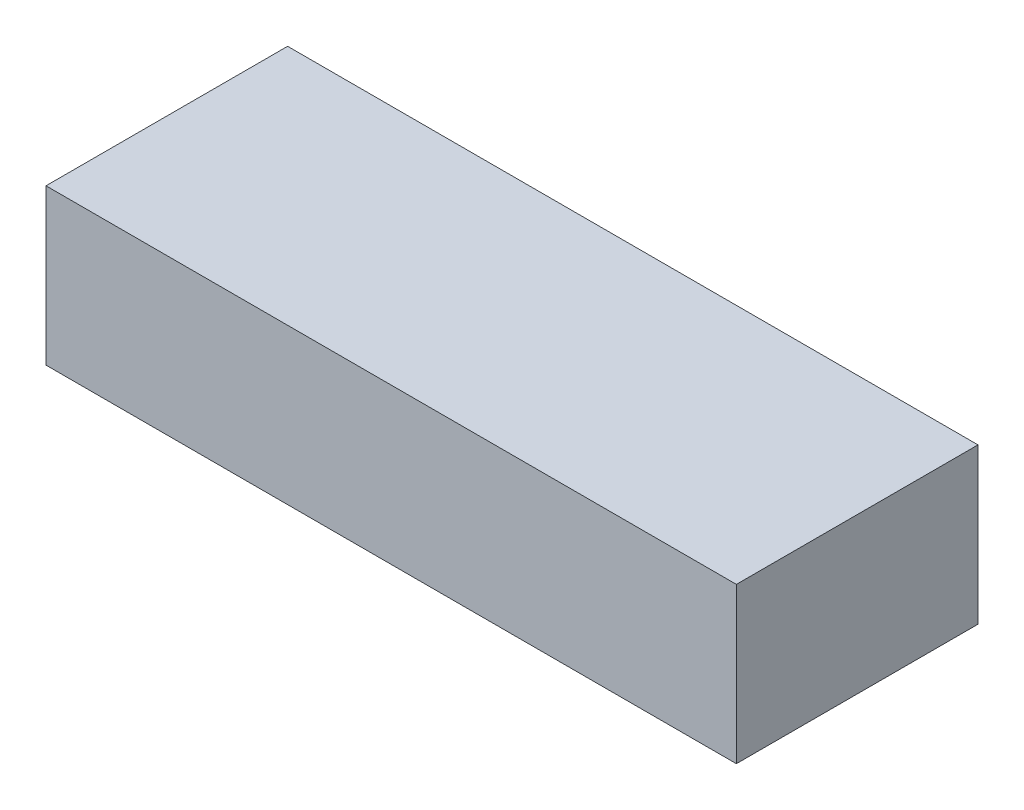
ISO-10303-21;
HEADER;
FILE_DESCRIPTION(('STEP AP214'),'2;1');
FILE_NAME('part.step','',(''),(''),'','','');
FILE_SCHEMA(('AUTOMOTIVE_DESIGN { 1 0 10303 214 1 1 1 1 }'));
ENDSEC;
DATA;
#1=APPLICATION_CONTEXT('core data for automotive mechanical design processes');
#2=APPLICATION_PROTOCOL_DEFINITION('international standard','automotive_design',2000,#1);
#3=PRODUCT_CONTEXT('',#1,'mechanical');
#4=PRODUCT('Part','Part','',(#3));
#5=PRODUCT_RELATED_PRODUCT_CATEGORY('part','',(#4));
#6=PRODUCT_DEFINITION_FORMATION('','',#4);
#7=PRODUCT_DEFINITION_CONTEXT('part definition',#1,'design');
#8=PRODUCT_DEFINITION('design','',#6,#7);
#9=PRODUCT_DEFINITION_SHAPE('','',#8);
#10=(LENGTH_UNIT() NAMED_UNIT(*) SI_UNIT(.MILLI.,.METRE.));
#11=(NAMED_UNIT(*) PLANE_ANGLE_UNIT() SI_UNIT($,.RADIAN.));
#12=(NAMED_UNIT(*) SI_UNIT($,.STERADIAN.) SOLID_ANGLE_UNIT());
#13=UNCERTAINTY_MEASURE_WITH_UNIT(LENGTH_MEASURE(1.E-05),#10,'distance_accuracy_value','');
#14=(GEOMETRIC_REPRESENTATION_CONTEXT(3) GLOBAL_UNCERTAINTY_ASSIGNED_CONTEXT((#13)) GLOBAL_UNIT_ASSIGNED_CONTEXT((#10,
#11,#12)) REPRESENTATION_CONTEXT('',''));
#15=CARTESIAN_POINT('',(0.,0.,0.));
#16=DIRECTION('',(0.,0.,1.));
#17=DIRECTION('',(1.,0.,0.));
#18=AXIS2_PLACEMENT_3D('',#15,#16,#17);
#19=CARTESIAN_POINT('',(20.,9.,-7.));
#20=DIRECTION('',(-1.,0.,0.));
#21=DIRECTION('',(0.,0.,1.));
#22=AXIS2_PLACEMENT_3D('',#19,#20,#21);
#23=PLANE('',#22);
#24=DIRECTION('',(0.,0.,-1.));
#25=VECTOR('',#24,1.);
#26=CARTESIAN_POINT('',(20.,0.,-7.));
#27=LINE('',#26,#25);
#28=CARTESIAN_POINT('',(20.,0.,7.));
#29=VERTEX_POINT('',#28);
#30=CARTESIAN_POINT('',(20.,0.,-7.));
#31=VERTEX_POINT('',#30);
#32=EDGE_CURVE('E96',#29,#31,#27,.T.);
#33=ORIENTED_EDGE('',*,*,#32,.T.);
#34=DIRECTION('',(0.,-1.,0.));
#35=VECTOR('',#34,1.);
#36=CARTESIAN_POINT('',(20.,9.,-7.));
#37=LINE('',#36,#35);
#38=CARTESIAN_POINT('',(20.,9.,-7.));
#39=VERTEX_POINT('',#38);
#40=EDGE_CURVE('E11',#39,#31,#37,.T.);
#41=ORIENTED_EDGE('',*,*,#40,.F.);
#42=DIRECTION('',(0.,0.,-1.));
#43=VECTOR('',#42,1.);
#44=CARTESIAN_POINT('',(20.,9.,-7.));
#45=LINE('',#44,#43);
#46=CARTESIAN_POINT('',(20.,9.,7.));
#47=VERTEX_POINT('',#46);
#48=EDGE_CURVE('E84',#47,#39,#45,.T.);
#49=ORIENTED_EDGE('',*,*,#48,.F.);
#50=DIRECTION('',(0.,-1.,0.));
#51=VECTOR('',#50,1.);
#52=CARTESIAN_POINT('',(20.,9.,7.));
#53=LINE('',#52,#51);
#54=EDGE_CURVE('E92',#47,#29,#53,.T.);
#55=ORIENTED_EDGE('',*,*,#54,.T.);
#56=EDGE_LOOP('',(#33,#41,#49,#55));
#57=FACE_BOUND('',#56,.T.);
#58=ADVANCED_FACE('F33',(#57),#23,.F.);
#59=CARTESIAN_POINT('',(-20.,9.,-7.));
#60=DIRECTION('',(0.,0.,1.));
#61=DIRECTION('',(1.,0.,0.));
#62=AXIS2_PLACEMENT_3D('',#59,#60,#61);
#63=PLANE('',#62);
#64=DIRECTION('',(-1.,0.,0.));
#65=VECTOR('',#64,1.);
#66=CARTESIAN_POINT('',(-20.,0.,-7.));
#67=LINE('',#66,#65);
#68=CARTESIAN_POINT('',(-20.,0.,-7.));
#69=VERTEX_POINT('',#68);
#70=EDGE_CURVE('E88',#31,#69,#67,.T.);
#71=ORIENTED_EDGE('',*,*,#70,.T.);
#72=DIRECTION('',(0.,-1.,0.));
#73=VECTOR('',#72,1.);
#74=CARTESIAN_POINT('',(-20.,9.,-7.));
#75=LINE('',#74,#73);
#76=CARTESIAN_POINT('',(-20.,9.,-7.));
#77=VERTEX_POINT('',#76);
#78=EDGE_CURVE('E41',#77,#69,#75,.T.);
#79=ORIENTED_EDGE('',*,*,#78,.F.);
#80=DIRECTION('',(-1.,0.,0.));
#81=VECTOR('',#80,1.);
#82=CARTESIAN_POINT('',(-20.,9.,-7.));
#83=LINE('',#82,#81);
#84=EDGE_CURVE('E79',#39,#77,#83,.T.);
#85=ORIENTED_EDGE('',*,*,#84,.F.);
#86=ORIENTED_EDGE('',*,*,#40,.T.);
#87=EDGE_LOOP('',(#71,#79,#85,#86));
#88=FACE_BOUND('',#87,.T.);
#89=ADVANCED_FACE('F87',(#88),#63,.F.);
#90=CARTESIAN_POINT('',(-20.,9.,-7.));
#91=DIRECTION('',(1.,0.,0.));
#92=DIRECTION('',(0.,0.,-1.));
#93=AXIS2_PLACEMENT_3D('',#90,#91,#92);
#94=PLANE('',#93);
#95=DIRECTION('',(0.,0.,1.));
#96=VECTOR('',#95,1.);
#97=CARTESIAN_POINT('',(-20.,0.,-7.));
#98=LINE('',#97,#96);
#99=CARTESIAN_POINT('',(-20.,0.,7.));
#100=VERTEX_POINT('',#99);
#101=EDGE_CURVE('E66',#69,#100,#98,.T.);
#102=ORIENTED_EDGE('',*,*,#101,.T.);
#103=DIRECTION('',(0.,-1.,0.));
#104=VECTOR('',#103,1.);
#105=CARTESIAN_POINT('',(-20.,9.,7.));
#106=LINE('',#105,#104);
#107=CARTESIAN_POINT('',(-20.,9.,7.));
#108=VERTEX_POINT('',#107);
#109=EDGE_CURVE('E89',#108,#100,#106,.T.);
#110=ORIENTED_EDGE('',*,*,#109,.F.);
#111=DIRECTION('',(0.,0.,1.));
#112=VECTOR('',#111,1.);
#113=CARTESIAN_POINT('',(-20.,9.,-7.));
#114=LINE('',#113,#112);
#115=EDGE_CURVE('E82',#77,#108,#114,.T.);
#116=ORIENTED_EDGE('',*,*,#115,.F.);
#117=ORIENTED_EDGE('',*,*,#78,.T.);
#118=EDGE_LOOP('',(#102,#110,#116,#117));
#119=FACE_BOUND('',#118,.T.);
#120=ADVANCED_FACE('F90',(#119),#94,.F.);
#121=CARTESIAN_POINT('',(-20.,9.,7.));
#122=DIRECTION('',(0.,0.,-1.));
#123=DIRECTION('',(-1.,0.,0.));
#124=AXIS2_PLACEMENT_3D('',#121,#122,#123);
#125=PLANE('',#124);
#126=DIRECTION('',(1.,0.,0.));
#127=VECTOR('',#126,1.);
#128=CARTESIAN_POINT('',(-20.,0.,7.));
#129=LINE('',#128,#127);
#130=EDGE_CURVE('E72',#100,#29,#129,.T.);
#131=ORIENTED_EDGE('',*,*,#130,.T.);
#132=ORIENTED_EDGE('',*,*,#54,.F.);
#133=DIRECTION('',(1.,0.,0.));
#134=VECTOR('',#133,1.);
#135=CARTESIAN_POINT('',(-20.,9.,7.));
#136=LINE('',#135,#134);
#137=EDGE_CURVE('E49',#108,#47,#136,.T.);
#138=ORIENTED_EDGE('',*,*,#137,.F.);
#139=ORIENTED_EDGE('',*,*,#109,.T.);
#140=EDGE_LOOP('',(#131,#132,#138,#139));
#141=FACE_BOUND('',#140,.T.);
#142=ADVANCED_FACE('F103',(#141),#125,.F.);
#143=CARTESIAN_POINT('',(0.,9.,0.));
#144=DIRECTION('',(0.,1.,0.));
#145=DIRECTION('',(0.,0.,1.));
#146=AXIS2_PLACEMENT_3D('',#143,#144,#145);
#147=PLANE('',#146);
#148=ORIENTED_EDGE('',*,*,#48,.T.);
#149=ORIENTED_EDGE('',*,*,#84,.T.);
#150=ORIENTED_EDGE('',*,*,#115,.T.);
#151=ORIENTED_EDGE('',*,*,#137,.T.);
#152=EDGE_LOOP('',(#148,#149,#150,#151));
#153=FACE_BOUND('',#152,.T.);
#154=ADVANCED_FACE('F80',(#153),#147,.T.);
#155=CARTESIAN_POINT('',(0.,0.,0.));
#156=DIRECTION('',(0.,1.,0.));
#157=DIRECTION('',(0.,0.,1.));
#158=AXIS2_PLACEMENT_3D('',#155,#156,#157);
#159=PLANE('',#158);
#160=ORIENTED_EDGE('',*,*,#32,.F.);
#161=ORIENTED_EDGE('',*,*,#130,.F.);
#162=ORIENTED_EDGE('',*,*,#101,.F.);
#163=ORIENTED_EDGE('',*,*,#70,.F.);
#164=EDGE_LOOP('',(#160,#161,#162,#163));
#165=FACE_BOUND('',#164,.T.);
#166=ADVANCED_FACE('F106',(#165),#159,.F.);
#167=CLOSED_SHELL('',(#58,#89,#120,#142,#154,#166));
#168=MANIFOLD_SOLID_BREP('B2',#167);
#169=ADVANCED_BREP_SHAPE_REPRESENTATION('',(#18,#168),#14);
#170=SHAPE_DEFINITION_REPRESENTATION(#9,#169);
ENDSEC;
END-ISO-10303-21;
